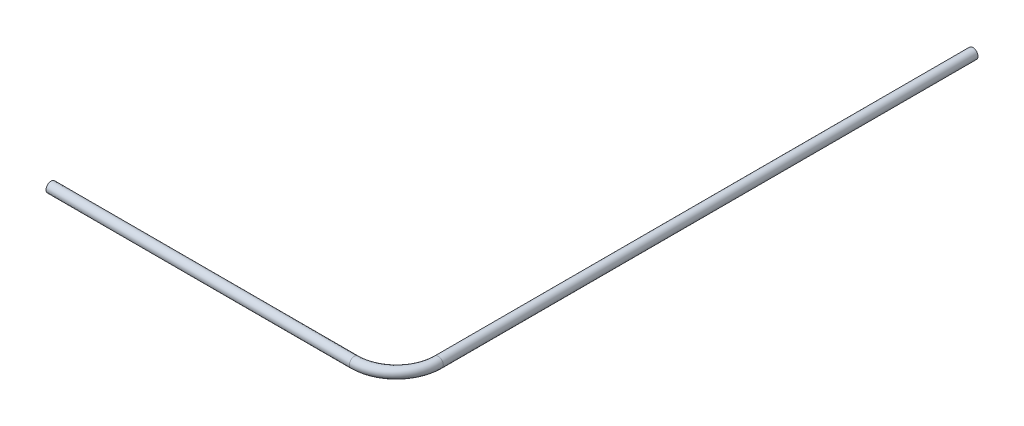
ISO-10303-21;
HEADER;
FILE_DESCRIPTION(('STEP AP214'),'2;1');
FILE_NAME('part.step','',(''),(''),'','','');
FILE_SCHEMA(('AUTOMOTIVE_DESIGN { 1 0 10303 214 1 1 1 1 }'));
ENDSEC;
DATA;
#1=APPLICATION_CONTEXT('core data for automotive mechanical design processes');
#2=APPLICATION_PROTOCOL_DEFINITION('international standard','automotive_design',2000,#1);
#3=PRODUCT_CONTEXT('',#1,'mechanical');
#4=PRODUCT('Part','Part','',(#3));
#5=PRODUCT_RELATED_PRODUCT_CATEGORY('part','',(#4));
#6=PRODUCT_DEFINITION_FORMATION('','',#4);
#7=PRODUCT_DEFINITION_CONTEXT('part definition',#1,'design');
#8=PRODUCT_DEFINITION('design','',#6,#7);
#9=PRODUCT_DEFINITION_SHAPE('','',#8);
#10=(LENGTH_UNIT() NAMED_UNIT(*) SI_UNIT(.MILLI.,.METRE.));
#11=(NAMED_UNIT(*) PLANE_ANGLE_UNIT() SI_UNIT($,.RADIAN.));
#12=(NAMED_UNIT(*) SI_UNIT($,.STERADIAN.) SOLID_ANGLE_UNIT());
#13=UNCERTAINTY_MEASURE_WITH_UNIT(LENGTH_MEASURE(1.E-05),#10,'distance_accuracy_value','');
#14=(GEOMETRIC_REPRESENTATION_CONTEXT(3) GLOBAL_UNCERTAINTY_ASSIGNED_CONTEXT((#13)) GLOBAL_UNIT_ASSIGNED_CONTEXT((#10,
#11,#12)) REPRESENTATION_CONTEXT('',''));
#15=CARTESIAN_POINT('',(0.,0.,0.));
#16=DIRECTION('',(0.,0.,1.));
#17=DIRECTION('',(1.,0.,0.));
#18=AXIS2_PLACEMENT_3D('',#15,#16,#17);
#19=CARTESIAN_POINT('',(-400.000000000002,0.,438.));
#20=DIRECTION('',(-1.,0.,0.));
#21=DIRECTION('',(0.,0.,1.));
#22=AXIS2_PLACEMENT_3D('',#19,#20,#21);
#23=PLANE('',#22);
#24=CARTESIAN_POINT('',(-400.000000000002,0.,438.));
#25=DIRECTION('',(-1.,0.,0.));
#26=DIRECTION('',(0.,0.,1.));
#27=AXIS2_PLACEMENT_3D('',#24,#25,#26);
#28=CIRCLE('',#27,6.00000000000002);
#29=CARTESIAN_POINT('',(-400.000000000002,0.,444.));
#30=VERTEX_POINT('',#29);
#31=EDGE_CURVE('E45',#30,#30,#28,.T.);
#32=ORIENTED_EDGE('',*,*,#31,.T.);
#33=EDGE_LOOP('',(#32));
#34=FACE_BOUND('',#33,.T.);
#35=ADVANCED_FACE('F31',(#34),#23,.T.);
#36=CARTESIAN_POINT('',(12.,0.,-250.));
#37=DIRECTION('',(0.,0.,1.));
#38=DIRECTION('',(1.,0.,0.));
#39=AXIS2_PLACEMENT_3D('',#36,#37,#38);
#40=PLANE('',#39);
#41=CARTESIAN_POINT('',(12.,0.,-250.));
#42=DIRECTION('',(0.,0.,1.));
#43=DIRECTION('',(1.,0.,0.));
#44=AXIS2_PLACEMENT_3D('',#41,#42,#43);
#45=CIRCLE('',#44,6.00000000000002);
#46=CARTESIAN_POINT('',(18.,0.,-250.));
#47=VERTEX_POINT('',#46);
#48=EDGE_CURVE('E10',#47,#47,#45,.T.);
#49=ORIENTED_EDGE('',*,*,#48,.F.);
#50=EDGE_LOOP('',(#49));
#51=FACE_BOUND('',#50,.T.);
#52=ADVANCED_FACE('F55',(#51),#40,.F.);
#53=CARTESIAN_POINT('',(-400.000000000002,0.,438.));
#54=DIRECTION('',(1.,0.,0.));
#55=DIRECTION('',(0.,0.,-1.));
#56=AXIS2_PLACEMENT_3D('',#53,#54,#55);
#57=CYLINDRICAL_SURFACE('',#56,6.00000000000002);
#58=CARTESIAN_POINT('',(-38.0000000000004,0.,438.));
#59=DIRECTION('',(-1.,0.,0.));
#60=DIRECTION('',(0.,0.,1.));
#61=AXIS2_PLACEMENT_3D('',#58,#59,#60);
#62=CIRCLE('',#61,6.00000000000002);
#63=CARTESIAN_POINT('',(-38.0000000000004,0.,444.));
#64=VERTEX_POINT('',#63);
#65=EDGE_CURVE('E41',#64,#64,#62,.T.);
#66=ORIENTED_EDGE('',*,*,#65,.T.);
#67=EDGE_LOOP('',(#66));
#68=FACE_BOUND('',#67,.T.);
#69=ORIENTED_EDGE('',*,*,#31,.F.);
#70=EDGE_LOOP('',(#69));
#71=FACE_BOUND('',#70,.T.);
#72=ADVANCED_FACE('F52',(#68,#71),#57,.T.);
#73=CARTESIAN_POINT('',(-38.,0.,388.));
#74=DIRECTION('',(0.,1.,0.));
#75=DIRECTION('',(0.,0.,1.));
#76=AXIS2_PLACEMENT_3D('',#73,#74,#75);
#77=TOROIDAL_SURFACE('',#76,50.,6.00000000000002);
#78=CARTESIAN_POINT('',(12.,0.,388.));
#79=DIRECTION('',(0.,0.,1.));
#80=DIRECTION('',(1.,0.,0.));
#81=AXIS2_PLACEMENT_3D('',#78,#79,#80);
#82=CIRCLE('',#81,6.00000000000002);
#83=CARTESIAN_POINT('',(18.0000000000001,0.,388.));
#84=VERTEX_POINT('',#83);
#85=EDGE_CURVE('E37',#84,#84,#82,.T.);
#86=CARTESIAN_POINT('',(-38.,0.,388.));
#87=DIRECTION('',(0.,1.,0.));
#88=DIRECTION('',(0.,0.,1.));
#89=AXIS2_PLACEMENT_3D('',#86,#87,#88);
#90=CIRCLE('',#89,56.);
#91=EDGE_CURVE('',#64,#84,#90,.T.);
#92=ORIENTED_EDGE('',*,*,#65,.F.);
#93=ORIENTED_EDGE('',*,*,#85,.T.);
#94=ORIENTED_EDGE('',*,*,#91,.T.);
#95=ORIENTED_EDGE('',*,*,#91,.F.);
#96=EDGE_LOOP('',(#92,#94,#93,#95));
#97=FACE_BOUND('',#96,.T.);
#98=ADVANCED_FACE('F54',(#97),#77,.T.);
#99=CARTESIAN_POINT('',(12.0000000000001,0.,388.));
#100=DIRECTION('',(0.,0.,-1.));
#101=DIRECTION('',(-1.,0.,0.));
#102=AXIS2_PLACEMENT_3D('',#99,#100,#101);
#103=CYLINDRICAL_SURFACE('',#102,6.00000000000002);
#104=ORIENTED_EDGE('',*,*,#48,.T.);
#105=EDGE_LOOP('',(#104));
#106=FACE_BOUND('',#105,.T.);
#107=ORIENTED_EDGE('',*,*,#85,.F.);
#108=EDGE_LOOP('',(#107));
#109=FACE_BOUND('',#108,.T.);
#110=ADVANCED_FACE('F62',(#106,#109),#103,.T.);
#111=CLOSED_SHELL('',(#35,#52,#72,#98,#110));
#112=MANIFOLD_SOLID_BREP('B2',#111);
#113=ADVANCED_BREP_SHAPE_REPRESENTATION('',(#18,#112),#14);
#114=SHAPE_DEFINITION_REPRESENTATION(#9,#113);
ENDSEC;
END-ISO-10303-21;
